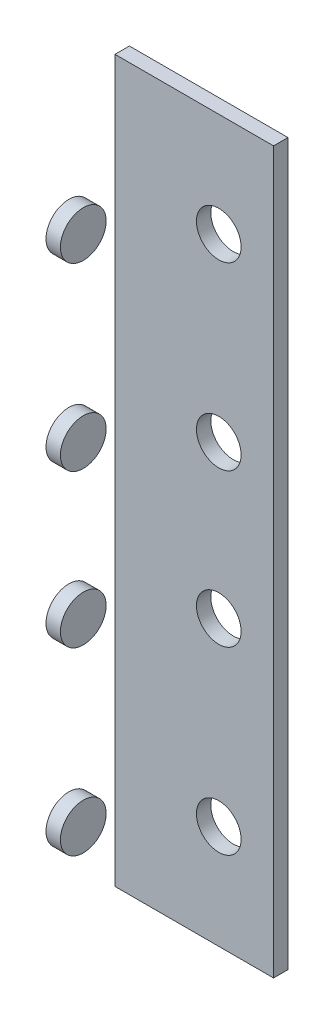
ISO-10303-21;
HEADER;
FILE_DESCRIPTION(('STEP AP214'),'2;1');
FILE_NAME('part.step','',(''),(''),'','','');
FILE_SCHEMA(('AUTOMOTIVE_DESIGN { 1 0 10303 214 1 1 1 1 }'));
ENDSEC;
DATA;
#1=APPLICATION_CONTEXT('core data for automotive mechanical design processes');
#2=APPLICATION_PROTOCOL_DEFINITION('international standard','automotive_design',2000,#1);
#3=PRODUCT_CONTEXT('',#1,'mechanical');
#4=PRODUCT('Part','Part','',(#3));
#5=PRODUCT_RELATED_PRODUCT_CATEGORY('part','',(#4));
#6=PRODUCT_DEFINITION_FORMATION('','',#4);
#7=PRODUCT_DEFINITION_CONTEXT('part definition',#1,'design');
#8=PRODUCT_DEFINITION('design','',#6,#7);
#9=PRODUCT_DEFINITION_SHAPE('','',#8);
#10=(LENGTH_UNIT() NAMED_UNIT(*) SI_UNIT(.MILLI.,.METRE.));
#11=(NAMED_UNIT(*) PLANE_ANGLE_UNIT() SI_UNIT($,.RADIAN.));
#12=(NAMED_UNIT(*) SI_UNIT($,.STERADIAN.) SOLID_ANGLE_UNIT());
#13=UNCERTAINTY_MEASURE_WITH_UNIT(LENGTH_MEASURE(1.E-05),#10,'distance_accuracy_value','');
#14=(GEOMETRIC_REPRESENTATION_CONTEXT(3) GLOBAL_UNCERTAINTY_ASSIGNED_CONTEXT((#13)) GLOBAL_UNIT_ASSIGNED_CONTEXT((#10,
#11,#12)) REPRESENTATION_CONTEXT('',''));
#15=CARTESIAN_POINT('',(0.,0.,0.));
#16=DIRECTION('',(0.,0.,1.));
#17=DIRECTION('',(1.,0.,0.));
#18=AXIS2_PLACEMENT_3D('',#15,#16,#17);
#19=CARTESIAN_POINT('',(0.,0.,-220.));
#20=DIRECTION('',(0.,0.,-1.));
#21=DIRECTION('',(-1.,0.,0.));
#22=AXIS2_PLACEMENT_3D('',#19,#20,#21);
#23=PLANE('',#22);
#24=DIRECTION('',(0.,-1.,0.));
#25=VECTOR('',#24,1.);
#26=CARTESIAN_POINT('',(-200.,-50.,-220.));
#27=LINE('',#26,#25);
#28=CARTESIAN_POINT('',(-200.,50.,-220.));
#29=VERTEX_POINT('',#28);
#30=CARTESIAN_POINT('',(-200.,-50.,-220.));
#31=VERTEX_POINT('',#30);
#32=EDGE_CURVE('E101',#29,#31,#27,.T.);
#33=ORIENTED_EDGE('',*,*,#32,.T.);
#34=DIRECTION('',(1.,0.,0.));
#35=VECTOR('',#34,1.);
#36=CARTESIAN_POINT('',(-200.,-50.,-220.));
#37=LINE('',#36,#35);
#38=CARTESIAN_POINT('',(-178.,-50.,-220.));
#39=VERTEX_POINT('',#38);
#40=EDGE_CURVE('E96',#31,#39,#37,.T.);
#41=ORIENTED_EDGE('',*,*,#40,.T.);
#42=DIRECTION('',(0.,1.,0.));
#43=VECTOR('',#42,1.);
#44=CARTESIAN_POINT('',(-178.,-50.,-220.));
#45=LINE('',#44,#43);
#46=CARTESIAN_POINT('',(-178.,50.,-220.));
#47=VERTEX_POINT('',#46);
#48=EDGE_CURVE('E99',#39,#47,#45,.T.);
#49=ORIENTED_EDGE('',*,*,#48,.T.);
#50=DIRECTION('',(-1.,0.,0.));
#51=VECTOR('',#50,1.);
#52=CARTESIAN_POINT('',(-200.,50.,-220.));
#53=LINE('',#52,#51);
#54=EDGE_CURVE('E66',#47,#29,#53,.T.);
#55=ORIENTED_EDGE('',*,*,#54,.T.);
#56=EDGE_LOOP('',(#33,#41,#49,#55));
#57=FACE_BOUND('',#56,.T.);
#58=CARTESIAN_POINT('',(-185.6,-35.6,-220.));
#59=DIRECTION('',(0.,0.,1.));
#60=DIRECTION('',(1.,0.,0.));
#61=AXIS2_PLACEMENT_3D('',#58,#59,#60);
#62=CIRCLE('',#61,3.0999999999998);
#63=CARTESIAN_POINT('',(-182.5,-35.6,-220.));
#64=VERTEX_POINT('',#63);
#65=EDGE_CURVE('E116',#64,#64,#62,.T.);
#66=ORIENTED_EDGE('',*,*,#65,.F.);
#67=EDGE_LOOP('',(#66));
#68=FACE_BOUND('',#67,.T.);
#69=CARTESIAN_POINT('',(-185.599999999999,-10.6,-220.));
#70=DIRECTION('',(0.,0.,1.));
#71=DIRECTION('',(1.,0.,0.));
#72=AXIS2_PLACEMENT_3D('',#69,#70,#71);
#73=CIRCLE('',#72,3.0999999999994);
#74=CARTESIAN_POINT('',(-182.5,-10.6,-220.));
#75=VERTEX_POINT('',#74);
#76=EDGE_CURVE('E131',#75,#75,#73,.T.);
#77=ORIENTED_EDGE('',*,*,#76,.F.);
#78=EDGE_LOOP('',(#77));
#79=FACE_BOUND('',#78,.T.);
#80=CARTESIAN_POINT('',(-185.599999999999,10.6,-220.));
#81=DIRECTION('',(0.,0.,1.));
#82=DIRECTION('',(1.,0.,0.));
#83=AXIS2_PLACEMENT_3D('',#80,#81,#82);
#84=CIRCLE('',#83,3.09999999999941);
#85=CARTESIAN_POINT('',(-182.5,10.6,-220.));
#86=VERTEX_POINT('',#85);
#87=EDGE_CURVE('E137',#86,#86,#84,.T.);
#88=ORIENTED_EDGE('',*,*,#87,.F.);
#89=EDGE_LOOP('',(#88));
#90=FACE_BOUND('',#89,.T.);
#91=CARTESIAN_POINT('',(-185.6,35.6,-220.));
#92=DIRECTION('',(0.,0.,1.));
#93=DIRECTION('',(1.,0.,0.));
#94=AXIS2_PLACEMENT_3D('',#91,#92,#93);
#95=CIRCLE('',#94,3.0999999999998);
#96=CARTESIAN_POINT('',(-182.5,35.6,-220.));
#97=VERTEX_POINT('',#96);
#98=EDGE_CURVE('E143',#97,#97,#95,.T.);
#99=ORIENTED_EDGE('',*,*,#98,.F.);
#100=EDGE_LOOP('',(#99));
#101=FACE_BOUND('',#100,.T.);
#102=ADVANCED_FACE('F49',(#57,#68,#79,#90,#101),#23,.F.);
#103=CARTESIAN_POINT('',(0.,0.,-222.));
#104=DIRECTION('',(0.,0.,-1.));
#105=DIRECTION('',(-1.,0.,0.));
#106=AXIS2_PLACEMENT_3D('',#103,#104,#105);
#107=PLANE('',#106);
#108=CARTESIAN_POINT('',(-185.599999999999,10.6,-222.));
#109=DIRECTION('',(0.,0.,1.));
#110=DIRECTION('',(1.,0.,0.));
#111=AXIS2_PLACEMENT_3D('',#108,#109,#110);
#112=CIRCLE('',#111,3.09999999999941);
#113=CARTESIAN_POINT('',(-182.5,10.6,-222.));
#114=VERTEX_POINT('',#113);
#115=EDGE_CURVE('E140',#114,#114,#112,.T.);
#116=ORIENTED_EDGE('',*,*,#115,.T.);
#117=EDGE_LOOP('',(#116));
#118=FACE_BOUND('',#117,.T.);
#119=CARTESIAN_POINT('',(-185.6,-35.6,-222.));
#120=DIRECTION('',(0.,0.,1.));
#121=DIRECTION('',(1.,0.,0.));
#122=AXIS2_PLACEMENT_3D('',#119,#120,#121);
#123=CIRCLE('',#122,3.0999999999998);
#124=CARTESIAN_POINT('',(-182.5,-35.6,-222.));
#125=VERTEX_POINT('',#124);
#126=EDGE_CURVE('E128',#125,#125,#123,.T.);
#127=ORIENTED_EDGE('',*,*,#126,.T.);
#128=EDGE_LOOP('',(#127));
#129=FACE_BOUND('',#128,.T.);
#130=DIRECTION('',(0.,-1.,0.));
#131=VECTOR('',#130,1.);
#132=CARTESIAN_POINT('',(-200.,-50.,-222.));
#133=LINE('',#132,#131);
#134=CARTESIAN_POINT('',(-200.,50.,-222.));
#135=VERTEX_POINT('',#134);
#136=CARTESIAN_POINT('',(-200.,-50.,-222.));
#137=VERTEX_POINT('',#136);
#138=EDGE_CURVE('E113',#135,#137,#133,.T.);
#139=ORIENTED_EDGE('',*,*,#138,.F.);
#140=DIRECTION('',(-1.,0.,0.));
#141=VECTOR('',#140,1.);
#142=CARTESIAN_POINT('',(-200.,50.,-222.));
#143=LINE('',#142,#141);
#144=CARTESIAN_POINT('',(-178.,50.,-222.));
#145=VERTEX_POINT('',#144);
#146=EDGE_CURVE('E89',#145,#135,#143,.T.);
#147=ORIENTED_EDGE('',*,*,#146,.F.);
#148=DIRECTION('',(0.,1.,0.));
#149=VECTOR('',#148,1.);
#150=CARTESIAN_POINT('',(-178.,-50.,-222.));
#151=LINE('',#150,#149);
#152=CARTESIAN_POINT('',(-178.,-50.,-222.));
#153=VERTEX_POINT('',#152);
#154=EDGE_CURVE('E83',#153,#145,#151,.T.);
#155=ORIENTED_EDGE('',*,*,#154,.F.);
#156=DIRECTION('',(1.,0.,0.));
#157=VECTOR('',#156,1.);
#158=CARTESIAN_POINT('',(-200.,-50.,-222.));
#159=LINE('',#158,#157);
#160=EDGE_CURVE('E105',#137,#153,#159,.T.);
#161=ORIENTED_EDGE('',*,*,#160,.F.);
#162=EDGE_LOOP('',(#139,#147,#155,#161));
#163=FACE_BOUND('',#162,.T.);
#164=CARTESIAN_POINT('',(-185.599999999999,-10.6,-222.));
#165=DIRECTION('',(0.,0.,1.));
#166=DIRECTION('',(1.,0.,0.));
#167=AXIS2_PLACEMENT_3D('',#164,#165,#166);
#168=CIRCLE('',#167,3.0999999999994);
#169=CARTESIAN_POINT('',(-182.5,-10.6,-222.));
#170=VERTEX_POINT('',#169);
#171=EDGE_CURVE('E134',#170,#170,#168,.T.);
#172=ORIENTED_EDGE('',*,*,#171,.T.);
#173=EDGE_LOOP('',(#172));
#174=FACE_BOUND('',#173,.T.);
#175=CARTESIAN_POINT('',(-185.6,35.6,-222.));
#176=DIRECTION('',(0.,0.,1.));
#177=DIRECTION('',(1.,0.,0.));
#178=AXIS2_PLACEMENT_3D('',#175,#176,#177);
#179=CIRCLE('',#178,3.0999999999998);
#180=CARTESIAN_POINT('',(-182.5,35.6,-222.));
#181=VERTEX_POINT('',#180);
#182=EDGE_CURVE('E146',#181,#181,#179,.T.);
#183=ORIENTED_EDGE('',*,*,#182,.T.);
#184=EDGE_LOOP('',(#183));
#185=FACE_BOUND('',#184,.T.);
#186=ADVANCED_FACE('F124',(#118,#129,#163,#174,#185),#107,.T.);
#187=CARTESIAN_POINT('',(-200.,-50.,-220.));
#188=DIRECTION('',(1.,0.,0.));
#189=DIRECTION('',(0.,0.,-1.));
#190=AXIS2_PLACEMENT_3D('',#187,#188,#189);
#191=PLANE('',#190);
#192=ORIENTED_EDGE('',*,*,#138,.T.);
#193=DIRECTION('',(0.,0.,-1.));
#194=VECTOR('',#193,1.);
#195=CARTESIAN_POINT('',(-200.,-50.,-220.));
#196=LINE('',#195,#194);
#197=EDGE_CURVE('E13',#31,#137,#196,.T.);
#198=ORIENTED_EDGE('',*,*,#197,.F.);
#199=ORIENTED_EDGE('',*,*,#32,.F.);
#200=DIRECTION('',(0.,0.,-1.));
#201=VECTOR('',#200,1.);
#202=CARTESIAN_POINT('',(-200.,50.,-220.));
#203=LINE('',#202,#201);
#204=EDGE_CURVE('E109',#29,#135,#203,.T.);
#205=ORIENTED_EDGE('',*,*,#204,.T.);
#206=EDGE_LOOP('',(#192,#198,#199,#205));
#207=FACE_BOUND('',#206,.T.);
#208=ADVANCED_FACE('F51',(#207),#191,.F.);
#209=CARTESIAN_POINT('',(-200.,-50.,-220.));
#210=DIRECTION('',(0.,1.,0.));
#211=DIRECTION('',(0.,0.,1.));
#212=AXIS2_PLACEMENT_3D('',#209,#210,#211);
#213=PLANE('',#212);
#214=ORIENTED_EDGE('',*,*,#160,.T.);
#215=DIRECTION('',(0.,0.,-1.));
#216=VECTOR('',#215,1.);
#217=CARTESIAN_POINT('',(-178.,-50.,-220.));
#218=LINE('',#217,#216);
#219=EDGE_CURVE('E58',#39,#153,#218,.T.);
#220=ORIENTED_EDGE('',*,*,#219,.F.);
#221=ORIENTED_EDGE('',*,*,#40,.F.);
#222=ORIENTED_EDGE('',*,*,#197,.T.);
#223=EDGE_LOOP('',(#214,#220,#221,#222));
#224=FACE_BOUND('',#223,.T.);
#225=ADVANCED_FACE('F104',(#224),#213,.F.);
#226=CARTESIAN_POINT('',(-178.,-50.,-220.));
#227=DIRECTION('',(-1.,0.,0.));
#228=DIRECTION('',(0.,0.,1.));
#229=AXIS2_PLACEMENT_3D('',#226,#227,#228);
#230=PLANE('',#229);
#231=ORIENTED_EDGE('',*,*,#154,.T.);
#232=DIRECTION('',(0.,0.,-1.));
#233=VECTOR('',#232,1.);
#234=CARTESIAN_POINT('',(-178.,50.,-220.));
#235=LINE('',#234,#233);
#236=EDGE_CURVE('E106',#47,#145,#235,.T.);
#237=ORIENTED_EDGE('',*,*,#236,.F.);
#238=ORIENTED_EDGE('',*,*,#48,.F.);
#239=ORIENTED_EDGE('',*,*,#219,.T.);
#240=EDGE_LOOP('',(#231,#237,#238,#239));
#241=FACE_BOUND('',#240,.T.);
#242=ADVANCED_FACE('F107',(#241),#230,.F.);
#243=CARTESIAN_POINT('',(-200.,50.,-220.));
#244=DIRECTION('',(0.,-1.,0.));
#245=DIRECTION('',(0.,0.,-1.));
#246=AXIS2_PLACEMENT_3D('',#243,#244,#245);
#247=PLANE('',#246);
#248=ORIENTED_EDGE('',*,*,#146,.T.);
#249=ORIENTED_EDGE('',*,*,#204,.F.);
#250=ORIENTED_EDGE('',*,*,#54,.F.);
#251=ORIENTED_EDGE('',*,*,#236,.T.);
#252=EDGE_LOOP('',(#248,#249,#250,#251));
#253=FACE_BOUND('',#252,.T.);
#254=ADVANCED_FACE('F121',(#253),#247,.F.);
#255=CARTESIAN_POINT('',(-185.6,-35.6,-220.));
#256=DIRECTION('',(0.,0.,-1.));
#257=DIRECTION('',(-1.,0.,0.));
#258=AXIS2_PLACEMENT_3D('',#255,#256,#257);
#259=CYLINDRICAL_SURFACE('',#258,3.0999999999998);
#260=ORIENTED_EDGE('',*,*,#65,.T.);
#261=EDGE_LOOP('',(#260));
#262=FACE_BOUND('',#261,.T.);
#263=ORIENTED_EDGE('',*,*,#126,.F.);
#264=EDGE_LOOP('',(#263));
#265=FACE_BOUND('',#264,.T.);
#266=ADVANCED_FACE('F163',(#262,#265),#259,.F.);
#267=CARTESIAN_POINT('',(-185.599999999999,-10.6,-220.));
#268=DIRECTION('',(0.,0.,-1.));
#269=DIRECTION('',(-1.,0.,0.));
#270=AXIS2_PLACEMENT_3D('',#267,#268,#269);
#271=CYLINDRICAL_SURFACE('',#270,3.0999999999994);
#272=ORIENTED_EDGE('',*,*,#76,.T.);
#273=EDGE_LOOP('',(#272));
#274=FACE_BOUND('',#273,.T.);
#275=ORIENTED_EDGE('',*,*,#171,.F.);
#276=EDGE_LOOP('',(#275));
#277=FACE_BOUND('',#276,.T.);
#278=ADVANCED_FACE('F208',(#274,#277),#271,.F.);
#279=CARTESIAN_POINT('',(-185.599999999999,10.6,-220.));
#280=DIRECTION('',(0.,0.,-1.));
#281=DIRECTION('',(-1.,0.,0.));
#282=AXIS2_PLACEMENT_3D('',#279,#280,#281);
#283=CYLINDRICAL_SURFACE('',#282,3.09999999999941);
#284=ORIENTED_EDGE('',*,*,#87,.T.);
#285=EDGE_LOOP('',(#284));
#286=FACE_BOUND('',#285,.T.);
#287=ORIENTED_EDGE('',*,*,#115,.F.);
#288=EDGE_LOOP('',(#287));
#289=FACE_BOUND('',#288,.T.);
#290=ADVANCED_FACE('F216',(#286,#289),#283,.F.);
#291=CARTESIAN_POINT('',(-185.6,35.6,-220.));
#292=DIRECTION('',(0.,0.,-1.));
#293=DIRECTION('',(-1.,0.,0.));
#294=AXIS2_PLACEMENT_3D('',#291,#292,#293);
#295=CYLINDRICAL_SURFACE('',#294,3.0999999999998);
#296=ORIENTED_EDGE('',*,*,#98,.T.);
#297=EDGE_LOOP('',(#296));
#298=FACE_BOUND('',#297,.T.);
#299=ORIENTED_EDGE('',*,*,#182,.F.);
#300=EDGE_LOOP('',(#299));
#301=FACE_BOUND('',#300,.T.);
#302=ADVANCED_FACE('F152',(#298,#301),#295,.F.);
#303=CLOSED_SHELL('',(#102,#186,#208,#225,#242,#254,#266,#278,#290,#302));
#304=MANIFOLD_SOLID_BREP('B2',#303);
#305=CARTESIAN_POINT('',(-195.,35.6,-210.6));
#306=DIRECTION('',(-1.,0.,0.));
#307=DIRECTION('',(0.,0.,1.));
#308=AXIS2_PLACEMENT_3D('',#305,#306,#307);
#309=CYLINDRICAL_SURFACE('',#308,3.175);
#310=CARTESIAN_POINT('',(-195.,35.6,-210.6));
#311=DIRECTION('',(1.,0.,0.));
#312=DIRECTION('',(0.,0.,-1.));
#313=AXIS2_PLACEMENT_3D('',#310,#311,#312);
#314=CIRCLE('',#313,3.175);
#315=CARTESIAN_POINT('',(-195.,35.6,-213.775));
#316=VERTEX_POINT('',#315);
#317=EDGE_CURVE('E269',#316,#316,#314,.T.);
#318=ORIENTED_EDGE('',*,*,#317,.F.);
#319=EDGE_LOOP('',(#318));
#320=FACE_BOUND('',#319,.T.);
#321=CARTESIAN_POINT('',(-197.,35.6,-210.6));
#322=DIRECTION('',(1.,0.,0.));
#323=DIRECTION('',(0.,0.,-1.));
#324=AXIS2_PLACEMENT_3D('',#321,#322,#323);
#325=CIRCLE('',#324,3.175);
#326=CARTESIAN_POINT('',(-197.,35.6,-213.775));
#327=VERTEX_POINT('',#326);
#328=EDGE_CURVE('E48',#327,#327,#325,.T.);
#329=ORIENTED_EDGE('',*,*,#328,.T.);
#330=EDGE_LOOP('',(#329));
#331=FACE_BOUND('',#330,.T.);
#332=ADVANCED_FACE('F265',(#320,#331),#309,.T.);
#333=CARTESIAN_POINT('',(-195.,35.6,-210.6));
#334=DIRECTION('',(1.,0.,0.));
#335=DIRECTION('',(0.,0.,-1.));
#336=AXIS2_PLACEMENT_3D('',#333,#334,#335);
#337=PLANE('',#336);
#338=ORIENTED_EDGE('',*,*,#317,.T.);
#339=EDGE_LOOP('',(#338));
#340=FACE_BOUND('',#339,.T.);
#341=ADVANCED_FACE('F267',(#340),#337,.T.);
#342=CARTESIAN_POINT('',(-197.,35.6,-210.6));
#343=DIRECTION('',(1.,0.,0.));
#344=DIRECTION('',(0.,0.,-1.));
#345=AXIS2_PLACEMENT_3D('',#342,#343,#344);
#346=PLANE('',#345);
#347=ORIENTED_EDGE('',*,*,#328,.F.);
#348=EDGE_LOOP('',(#347));
#349=FACE_BOUND('',#348,.T.);
#350=ADVANCED_FACE('F284',(#349),#346,.F.);
#351=CLOSED_SHELL('',(#332,#341,#350));
#352=MANIFOLD_SOLID_BREP('B7',#351);
#353=CARTESIAN_POINT('',(-195.,10.6,-210.6));
#354=DIRECTION('',(-1.,0.,0.));
#355=DIRECTION('',(0.,0.,1.));
#356=AXIS2_PLACEMENT_3D('',#353,#354,#355);
#357=CYLINDRICAL_SURFACE('',#356,3.175);
#358=CARTESIAN_POINT('',(-195.,10.6,-210.6));
#359=DIRECTION('',(1.,0.,0.));
#360=DIRECTION('',(0.,0.,-1.));
#361=AXIS2_PLACEMENT_3D('',#358,#359,#360);
#362=CIRCLE('',#361,3.175);
#363=CARTESIAN_POINT('',(-195.,10.6,-213.775));
#364=VERTEX_POINT('',#363);
#365=EDGE_CURVE('E318',#364,#364,#362,.T.);
#366=ORIENTED_EDGE('',*,*,#365,.F.);
#367=EDGE_LOOP('',(#366));
#368=FACE_BOUND('',#367,.T.);
#369=CARTESIAN_POINT('',(-197.,10.6,-210.6));
#370=DIRECTION('',(1.,0.,0.));
#371=DIRECTION('',(0.,0.,-1.));
#372=AXIS2_PLACEMENT_3D('',#369,#370,#371);
#373=CIRCLE('',#372,3.175);
#374=CARTESIAN_POINT('',(-197.,10.6,-213.775));
#375=VERTEX_POINT('',#374);
#376=EDGE_CURVE('E264',#375,#375,#373,.T.);
#377=ORIENTED_EDGE('',*,*,#376,.T.);
#378=EDGE_LOOP('',(#377));
#379=FACE_BOUND('',#378,.T.);
#380=ADVANCED_FACE('F314',(#368,#379),#357,.T.);
#381=CARTESIAN_POINT('',(-195.,10.6,-210.6));
#382=DIRECTION('',(1.,0.,0.));
#383=DIRECTION('',(0.,0.,-1.));
#384=AXIS2_PLACEMENT_3D('',#381,#382,#383);
#385=PLANE('',#384);
#386=ORIENTED_EDGE('',*,*,#365,.T.);
#387=EDGE_LOOP('',(#386));
#388=FACE_BOUND('',#387,.T.);
#389=ADVANCED_FACE('F316',(#388),#385,.T.);
#390=CARTESIAN_POINT('',(-197.,10.6,-210.6));
#391=DIRECTION('',(1.,0.,0.));
#392=DIRECTION('',(0.,0.,-1.));
#393=AXIS2_PLACEMENT_3D('',#390,#391,#392);
#394=PLANE('',#393);
#395=ORIENTED_EDGE('',*,*,#376,.F.);
#396=EDGE_LOOP('',(#395));
#397=FACE_BOUND('',#396,.T.);
#398=ADVANCED_FACE('F333',(#397),#394,.F.);
#399=CLOSED_SHELL('',(#380,#389,#398));
#400=MANIFOLD_SOLID_BREP('B43',#399);
#401=CARTESIAN_POINT('',(-195.,-10.6,-210.6));
#402=DIRECTION('',(-1.,0.,0.));
#403=DIRECTION('',(0.,0.,1.));
#404=AXIS2_PLACEMENT_3D('',#401,#402,#403);
#405=CYLINDRICAL_SURFACE('',#404,3.175);
#406=CARTESIAN_POINT('',(-195.,-10.6,-210.6));
#407=DIRECTION('',(1.,0.,0.));
#408=DIRECTION('',(0.,0.,-1.));
#409=AXIS2_PLACEMENT_3D('',#406,#407,#408);
#410=CIRCLE('',#409,3.175);
#411=CARTESIAN_POINT('',(-195.,-10.6,-213.775));
#412=VERTEX_POINT('',#411);
#413=EDGE_CURVE('E366',#412,#412,#410,.T.);
#414=ORIENTED_EDGE('',*,*,#413,.F.);
#415=EDGE_LOOP('',(#414));
#416=FACE_BOUND('',#415,.T.);
#417=CARTESIAN_POINT('',(-197.,-10.6,-210.6));
#418=DIRECTION('',(1.,0.,0.));
#419=DIRECTION('',(0.,0.,-1.));
#420=AXIS2_PLACEMENT_3D('',#417,#418,#419);
#421=CIRCLE('',#420,3.175);
#422=CARTESIAN_POINT('',(-197.,-10.6,-213.775));
#423=VERTEX_POINT('',#422);
#424=EDGE_CURVE('E313',#423,#423,#421,.T.);
#425=ORIENTED_EDGE('',*,*,#424,.T.);
#426=EDGE_LOOP('',(#425));
#427=FACE_BOUND('',#426,.T.);
#428=ADVANCED_FACE('F362',(#416,#427),#405,.T.);
#429=CARTESIAN_POINT('',(-195.,-10.6,-210.6));
#430=DIRECTION('',(1.,0.,0.));
#431=DIRECTION('',(0.,0.,-1.));
#432=AXIS2_PLACEMENT_3D('',#429,#430,#431);
#433=PLANE('',#432);
#434=ORIENTED_EDGE('',*,*,#413,.T.);
#435=EDGE_LOOP('',(#434));
#436=FACE_BOUND('',#435,.T.);
#437=ADVANCED_FACE('F364',(#436),#433,.T.);
#438=CARTESIAN_POINT('',(-197.,-10.6,-210.6));
#439=DIRECTION('',(1.,0.,0.));
#440=DIRECTION('',(0.,0.,-1.));
#441=AXIS2_PLACEMENT_3D('',#438,#439,#440);
#442=PLANE('',#441);
#443=ORIENTED_EDGE('',*,*,#424,.F.);
#444=EDGE_LOOP('',(#443));
#445=FACE_BOUND('',#444,.T.);
#446=ADVANCED_FACE('F381',(#445),#442,.F.);
#447=CLOSED_SHELL('',(#428,#437,#446));
#448=MANIFOLD_SOLID_BREP('B259',#447);
#449=CARTESIAN_POINT('',(-195.,-35.6,-210.6));
#450=DIRECTION('',(-1.,0.,0.));
#451=DIRECTION('',(0.,0.,1.));
#452=AXIS2_PLACEMENT_3D('',#449,#450,#451);
#453=CYLINDRICAL_SURFACE('',#452,3.175);
#454=CARTESIAN_POINT('',(-195.,-35.6,-210.6));
#455=DIRECTION('',(1.,0.,0.));
#456=DIRECTION('',(0.,0.,-1.));
#457=AXIS2_PLACEMENT_3D('',#454,#455,#456);
#458=CIRCLE('',#457,3.175);
#459=CARTESIAN_POINT('',(-195.,-35.6,-213.775));
#460=VERTEX_POINT('',#459);
#461=EDGE_CURVE('E407',#460,#460,#458,.T.);
#462=ORIENTED_EDGE('',*,*,#461,.F.);
#463=EDGE_LOOP('',(#462));
#464=FACE_BOUND('',#463,.T.);
#465=CARTESIAN_POINT('',(-197.,-35.6,-210.6));
#466=DIRECTION('',(1.,0.,0.));
#467=DIRECTION('',(0.,0.,-1.));
#468=AXIS2_PLACEMENT_3D('',#465,#466,#467);
#469=CIRCLE('',#468,3.175);
#470=CARTESIAN_POINT('',(-197.,-35.6,-213.775));
#471=VERTEX_POINT('',#470);
#472=EDGE_CURVE('E361',#471,#471,#469,.T.);
#473=ORIENTED_EDGE('',*,*,#472,.T.);
#474=EDGE_LOOP('',(#473));
#475=FACE_BOUND('',#474,.T.);
#476=ADVANCED_FACE('F403',(#464,#475),#453,.T.);
#477=CARTESIAN_POINT('',(-195.,-35.6,-210.6));
#478=DIRECTION('',(1.,0.,0.));
#479=DIRECTION('',(0.,0.,-1.));
#480=AXIS2_PLACEMENT_3D('',#477,#478,#479);
#481=PLANE('',#480);
#482=ORIENTED_EDGE('',*,*,#461,.T.);
#483=EDGE_LOOP('',(#482));
#484=FACE_BOUND('',#483,.T.);
#485=ADVANCED_FACE('F405',(#484),#481,.T.);
#486=CARTESIAN_POINT('',(-197.,-35.6,-210.6));
#487=DIRECTION('',(1.,0.,0.));
#488=DIRECTION('',(0.,0.,-1.));
#489=AXIS2_PLACEMENT_3D('',#486,#487,#488);
#490=PLANE('',#489);
#491=ORIENTED_EDGE('',*,*,#472,.F.);
#492=EDGE_LOOP('',(#491));
#493=FACE_BOUND('',#492,.T.);
#494=ADVANCED_FACE('F422',(#493),#490,.F.);
#495=CLOSED_SHELL('',(#476,#485,#494));
#496=MANIFOLD_SOLID_BREP('B308',#495);
#497=ADVANCED_BREP_SHAPE_REPRESENTATION('',(#18,#304,#352,#400,#448,#496),#14);
#498=SHAPE_DEFINITION_REPRESENTATION(#9,#497);
ENDSEC;
END-ISO-10303-21;
